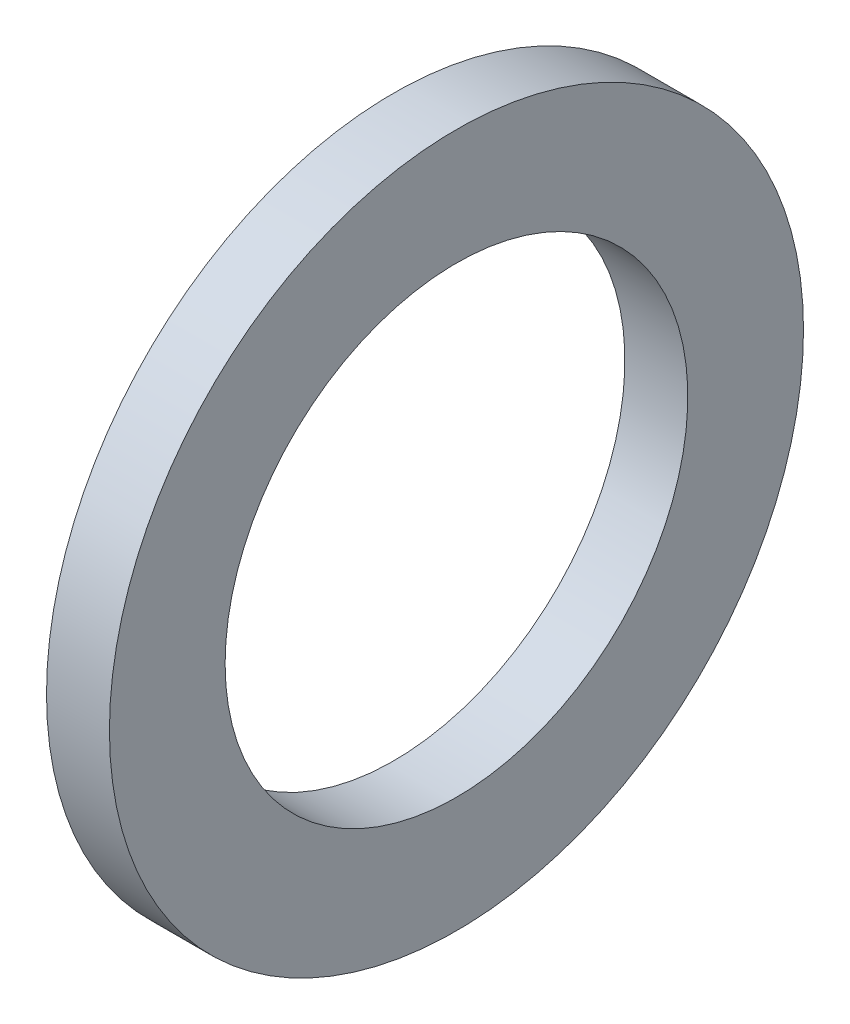
ISO-10303-21;
HEADER;
FILE_DESCRIPTION(('STEP AP214'),'2;1');
FILE_NAME('part.step','',(''),(''),'','','');
FILE_SCHEMA(('AUTOMOTIVE_DESIGN { 1 0 10303 214 1 1 1 1 }'));
ENDSEC;
DATA;
#1=APPLICATION_CONTEXT('core data for automotive mechanical design processes');
#2=APPLICATION_PROTOCOL_DEFINITION('international standard','automotive_design',2000,#1);
#3=PRODUCT_CONTEXT('',#1,'mechanical');
#4=PRODUCT('Part','Part','',(#3));
#5=PRODUCT_RELATED_PRODUCT_CATEGORY('part','',(#4));
#6=PRODUCT_DEFINITION_FORMATION('','',#4);
#7=PRODUCT_DEFINITION_CONTEXT('part definition',#1,'design');
#8=PRODUCT_DEFINITION('design','',#6,#7);
#9=PRODUCT_DEFINITION_SHAPE('','',#8);
#10=(LENGTH_UNIT() NAMED_UNIT(*) SI_UNIT(.MILLI.,.METRE.));
#11=(NAMED_UNIT(*) PLANE_ANGLE_UNIT() SI_UNIT($,.RADIAN.));
#12=(NAMED_UNIT(*) SI_UNIT($,.STERADIAN.) SOLID_ANGLE_UNIT());
#13=UNCERTAINTY_MEASURE_WITH_UNIT(LENGTH_MEASURE(1.E-05),#10,'distance_accuracy_value','');
#14=(GEOMETRIC_REPRESENTATION_CONTEXT(3) GLOBAL_UNCERTAINTY_ASSIGNED_CONTEXT((#13)) GLOBAL_UNIT_ASSIGNED_CONTEXT((#10,
#11,#12)) REPRESENTATION_CONTEXT('',''));
#15=CARTESIAN_POINT('',(0.,0.,0.));
#16=DIRECTION('',(0.,0.,1.));
#17=DIRECTION('',(1.,0.,0.));
#18=AXIS2_PLACEMENT_3D('',#15,#16,#17);
#19=CARTESIAN_POINT('',(0.,0.,0.));
#20=DIRECTION('',(1.,0.,0.));
#21=DIRECTION('',(0.,0.,-1.));
#22=AXIS2_PLACEMENT_3D('',#19,#20,#21);
#23=PLANE('',#22);
#24=CARTESIAN_POINT('',(0.,0.,0.));
#25=DIRECTION('',(-1.,0.,0.));
#26=DIRECTION('',(0.,0.,1.));
#27=AXIS2_PLACEMENT_3D('',#24,#25,#26);
#28=CIRCLE('',#27,3.175);
#29=CARTESIAN_POINT('',(0.,0.,3.175));
#30=VERTEX_POINT('',#29);
#31=EDGE_CURVE('E27',#30,#30,#28,.F.);
#32=ORIENTED_EDGE('',*,*,#31,.T.);
#33=EDGE_LOOP('',(#32));
#34=FACE_BOUND('',#33,.T.);
#35=CARTESIAN_POINT('',(0.,0.,0.));
#36=DIRECTION('',(-1.,0.,0.));
#37=DIRECTION('',(0.,0.,1.));
#38=AXIS2_PLACEMENT_3D('',#35,#36,#37);
#39=CIRCLE('',#38,4.7625);
#40=CARTESIAN_POINT('',(0.,0.,4.7625));
#41=VERTEX_POINT('',#40);
#42=EDGE_CURVE('E18',#41,#41,#39,.F.);
#43=ORIENTED_EDGE('',*,*,#42,.F.);
#44=EDGE_LOOP('',(#43));
#45=FACE_BOUND('',#44,.T.);
#46=ADVANCED_FACE('F15',(#34,#45),#23,.F.);
#47=CARTESIAN_POINT('',(0.8636,0.,0.));
#48=DIRECTION('',(-1.,0.,0.));
#49=DIRECTION('',(0.,0.,1.));
#50=AXIS2_PLACEMENT_3D('',#47,#48,#49);
#51=CYLINDRICAL_SURFACE('',#50,4.7625);
#52=ORIENTED_EDGE('',*,*,#42,.T.);
#53=EDGE_LOOP('',(#52));
#54=FACE_BOUND('',#53,.T.);
#55=CARTESIAN_POINT('',(0.8636,0.,0.));
#56=DIRECTION('',(-1.,0.,0.));
#57=DIRECTION('',(0.,0.,1.));
#58=AXIS2_PLACEMENT_3D('',#55,#56,#57);
#59=CIRCLE('',#58,4.7625);
#60=CARTESIAN_POINT('',(0.8636,0.,4.7625));
#61=VERTEX_POINT('',#60);
#62=EDGE_CURVE('E22',#61,#61,#59,.F.);
#63=ORIENTED_EDGE('',*,*,#62,.F.);
#64=EDGE_LOOP('',(#63));
#65=FACE_BOUND('',#64,.T.);
#66=ADVANCED_FACE('F35',(#54,#65),#51,.T.);
#67=CARTESIAN_POINT('',(0.8636,0.,0.));
#68=DIRECTION('',(-1.,0.,0.));
#69=DIRECTION('',(0.,0.,1.));
#70=AXIS2_PLACEMENT_3D('',#67,#68,#69);
#71=CYLINDRICAL_SURFACE('',#70,3.175);
#72=CARTESIAN_POINT('',(0.8636,0.,0.));
#73=DIRECTION('',(-1.,0.,0.));
#74=DIRECTION('',(0.,0.,1.));
#75=AXIS2_PLACEMENT_3D('',#72,#73,#74);
#76=CIRCLE('',#75,3.175);
#77=CARTESIAN_POINT('',(0.8636,0.,3.175));
#78=VERTEX_POINT('',#77);
#79=EDGE_CURVE('E10',#78,#78,#76,.T.);
#80=ORIENTED_EDGE('',*,*,#79,.F.);
#81=EDGE_LOOP('',(#80));
#82=FACE_BOUND('',#81,.T.);
#83=ORIENTED_EDGE('',*,*,#31,.F.);
#84=EDGE_LOOP('',(#83));
#85=FACE_BOUND('',#84,.T.);
#86=ADVANCED_FACE('F43',(#82,#85),#71,.F.);
#87=CARTESIAN_POINT('',(0.8636,0.,0.));
#88=DIRECTION('',(1.,0.,0.));
#89=DIRECTION('',(0.,0.,-1.));
#90=AXIS2_PLACEMENT_3D('',#87,#88,#89);
#91=PLANE('',#90);
#92=ORIENTED_EDGE('',*,*,#79,.T.);
#93=EDGE_LOOP('',(#92));
#94=FACE_BOUND('',#93,.T.);
#95=ORIENTED_EDGE('',*,*,#62,.T.);
#96=EDGE_LOOP('',(#95));
#97=FACE_BOUND('',#96,.T.);
#98=ADVANCED_FACE('F44',(#94,#97),#91,.T.);
#99=CLOSED_SHELL('',(#46,#66,#86,#98));
#100=MANIFOLD_SOLID_BREP('B1',#99);
#101=ADVANCED_BREP_SHAPE_REPRESENTATION('',(#18,#100),#14);
#102=SHAPE_DEFINITION_REPRESENTATION(#9,#101);
ENDSEC;
END-ISO-10303-21;
